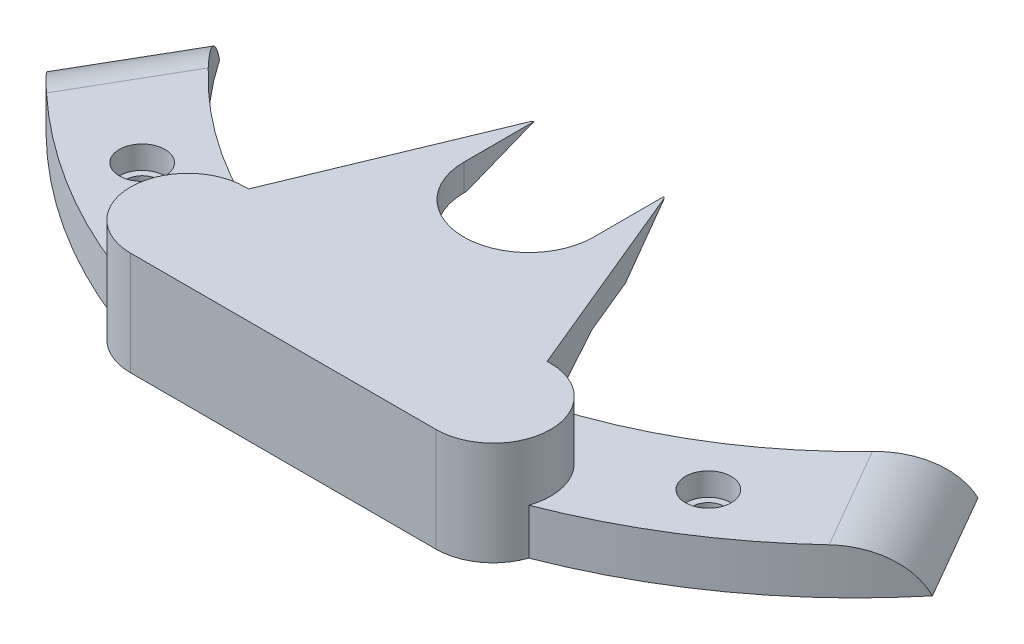
ISO-10303-21;
HEADER;
FILE_DESCRIPTION(('STEP AP214'),'2;1');
FILE_NAME('part.step','',(''),(''),'','','');
FILE_SCHEMA(('AUTOMOTIVE_DESIGN { 1 0 10303 214 1 1 1 1 }'));
ENDSEC;
DATA;
#1=APPLICATION_CONTEXT('core data for automotive mechanical design processes');
#2=APPLICATION_PROTOCOL_DEFINITION('international standard','automotive_design',2000,#1);
#3=PRODUCT_CONTEXT('',#1,'mechanical');
#4=PRODUCT('Part','Part','',(#3));
#5=PRODUCT_RELATED_PRODUCT_CATEGORY('part','',(#4));
#6=PRODUCT_DEFINITION_FORMATION('','',#4);
#7=PRODUCT_DEFINITION_CONTEXT('part definition',#1,'design');
#8=PRODUCT_DEFINITION('design','',#6,#7);
#9=PRODUCT_DEFINITION_SHAPE('','',#8);
#10=(LENGTH_UNIT() NAMED_UNIT(*) SI_UNIT(.MILLI.,.METRE.));
#11=(NAMED_UNIT(*) PLANE_ANGLE_UNIT() SI_UNIT($,.RADIAN.));
#12=(NAMED_UNIT(*) SI_UNIT($,.STERADIAN.) SOLID_ANGLE_UNIT());
#13=UNCERTAINTY_MEASURE_WITH_UNIT(LENGTH_MEASURE(1.E-05),#10,'distance_accuracy_value','');
#14=(GEOMETRIC_REPRESENTATION_CONTEXT(3) GLOBAL_UNCERTAINTY_ASSIGNED_CONTEXT((#13)) GLOBAL_UNIT_ASSIGNED_CONTEXT((#10,
#11,#12)) REPRESENTATION_CONTEXT('',''));
#15=CARTESIAN_POINT('',(0.,0.,0.));
#16=DIRECTION('',(0.,0.,1.));
#17=DIRECTION('',(1.,0.,0.));
#18=AXIS2_PLACEMENT_3D('',#15,#16,#17);
#19=CARTESIAN_POINT('',(37.0643969767601,-0.678255730241038,-11.0875109818614));
#20=DIRECTION('',(0.,1.,0.));
#21=DIRECTION('',(0.,0.,1.));
#22=AXIS2_PLACEMENT_3D('',#19,#20,#21);
#23=CYLINDRICAL_SURFACE('',#22,2.15);
#24=CARTESIAN_POINT('',(37.0643969767601,0.,-11.0875109818614));
#25=DIRECTION('',(0.,1.,0.));
#26=DIRECTION('',(0.,0.,1.));
#27=AXIS2_PLACEMENT_3D('',#24,#25,#26);
#28=CIRCLE('',#27,2.15);
#29=CARTESIAN_POINT('',(37.0643969767601,0.,-8.93751098186139));
#30=VERTEX_POINT('',#29);
#31=EDGE_CURVE('E203',#30,#30,#28,.T.);
#32=ORIENTED_EDGE('',*,*,#31,.F.);
#33=EDGE_LOOP('',(#32));
#34=FACE_BOUND('',#33,.T.);
#35=CARTESIAN_POINT('',(37.0643969767601,3.,-11.0875109818614));
#36=DIRECTION('',(0.,1.,0.));
#37=DIRECTION('',(0.,0.,1.));
#38=AXIS2_PLACEMENT_3D('',#35,#36,#37);
#39=CIRCLE('',#38,2.15);
#40=CARTESIAN_POINT('',(37.0643969767601,3.,-8.93751098186139));
#41=VERTEX_POINT('',#40);
#42=EDGE_CURVE('E293',#41,#41,#39,.T.);
#43=ORIENTED_EDGE('',*,*,#42,.T.);
#44=EDGE_LOOP('',(#43));
#45=FACE_BOUND('',#44,.T.);
#46=ADVANCED_FACE('F44',(#34,#45),#23,.F.);
#47=CARTESIAN_POINT('',(0.,0.,0.));
#48=DIRECTION('',(0.,1.,0.));
#49=DIRECTION('',(0.,0.,1.));
#50=AXIS2_PLACEMENT_3D('',#47,#48,#49);
#51=PLANE('',#50);
#52=DIRECTION('',(-0.500000000000002,0.,0.866025403784438));
#53=VECTOR('',#52,1.);
#54=CARTESIAN_POINT('',(-51.876435834862,0.,-29.9508741938561));
#55=LINE('',#54,#53);
#56=CARTESIAN_POINT('',(-49.6484768628359,0.,-33.8098123305843));
#57=VERTEX_POINT('',#56);
#58=CARTESIAN_POINT('',(-57.7945080633783,0.,-19.7004724112036));
#59=VERTEX_POINT('',#58);
#60=EDGE_CURVE('E202',#57,#59,#55,.T.);
#61=ORIENTED_EDGE('',*,*,#60,.F.);
#62=CARTESIAN_POINT('',(0.,0.,-67.5));
#63=DIRECTION('',(0.,1.,0.));
#64=DIRECTION('',(0.,0.,1.));
#65=AXIS2_PLACEMENT_3D('',#62,#63,#64);
#66=CIRCLE('',#65,60.);
#67=CARTESIAN_POINT('',(49.6484768628359,0.,-33.8098123305843));
#68=VERTEX_POINT('',#67);
#69=EDGE_CURVE('E190',#57,#68,#66,.T.);
#70=ORIENTED_EDGE('',*,*,#69,.T.);
#71=DIRECTION('',(0.500000000000002,0.,0.866025403784438));
#72=VECTOR('',#71,1.);
#73=CARTESIAN_POINT('',(51.8764358348621,0.,-29.9508741938561));
#74=LINE('',#73,#72);
#75=CARTESIAN_POINT('',(57.7945080633783,0.,-19.7004724112036));
#76=VERTEX_POINT('',#75);
#77=EDGE_CURVE('E335',#68,#76,#74,.T.);
#78=ORIENTED_EDGE('',*,*,#77,.T.);
#79=CARTESIAN_POINT('',(0.,0.,-67.5));
#80=DIRECTION('',(0.,1.,0.));
#81=DIRECTION('',(0.,0.,1.));
#82=AXIS2_PLACEMENT_3D('',#79,#80,#81);
#83=CIRCLE('',#82,75.);
#84=CARTESIAN_POINT('',(27.0936388955902,0.,2.43521810501034));
#85=VERTEX_POINT('',#84);
#86=EDGE_CURVE('E213',#85,#76,#83,.T.);
#87=ORIENTED_EDGE('',*,*,#86,.F.);
#88=CARTESIAN_POINT('',(20.,0.,0.));
#89=DIRECTION('',(0.,1.,0.));
#90=DIRECTION('',(0.,0.,1.));
#91=AXIS2_PLACEMENT_3D('',#88,#89,#90);
#92=CIRCLE('',#91,7.5);
#93=CARTESIAN_POINT('',(20.,0.,7.5));
#94=VERTEX_POINT('',#93);
#95=EDGE_CURVE('E449',#94,#85,#92,.T.);
#96=ORIENTED_EDGE('',*,*,#95,.F.);
#97=DIRECTION('',(-1.,0.,0.));
#98=VECTOR('',#97,1.);
#99=CARTESIAN_POINT('',(0.,0.,7.50000000000001));
#100=LINE('',#99,#98);
#101=CARTESIAN_POINT('',(-20.,0.,7.5));
#102=VERTEX_POINT('',#101);
#103=EDGE_CURVE('E455',#94,#102,#100,.T.);
#104=ORIENTED_EDGE('',*,*,#103,.T.);
#105=CARTESIAN_POINT('',(-20.,0.,0.));
#106=DIRECTION('',(0.,1.,0.));
#107=DIRECTION('',(0.,0.,1.));
#108=AXIS2_PLACEMENT_3D('',#105,#106,#107);
#109=CIRCLE('',#108,7.5);
#110=CARTESIAN_POINT('',(-27.0936388955902,0.,2.43521810501034));
#111=VERTEX_POINT('',#110);
#112=EDGE_CURVE('E469',#111,#102,#109,.T.);
#113=ORIENTED_EDGE('',*,*,#112,.F.);
#114=EDGE_CURVE('E210',#59,#111,#83,.T.);
#115=ORIENTED_EDGE('',*,*,#114,.F.);
#116=EDGE_LOOP('',(#61,#70,#78,#87,#96,#104,#113,#115));
#117=FACE_BOUND('',#116,.T.);
#118=CARTESIAN_POINT('',(-37.0643969767601,0.,-11.0875109818614));
#119=DIRECTION('',(0.,1.,0.));
#120=DIRECTION('',(0.,0.,1.));
#121=AXIS2_PLACEMENT_3D('',#118,#119,#120);
#122=CIRCLE('',#121,2.15);
#123=CARTESIAN_POINT('',(-37.0643969767601,0.,-8.93751098186139));
#124=VERTEX_POINT('',#123);
#125=EDGE_CURVE('E298',#124,#124,#122,.F.);
#126=ORIENTED_EDGE('',*,*,#125,.F.);
#127=EDGE_LOOP('',(#126));
#128=FACE_BOUND('',#127,.T.);
#129=ORIENTED_EDGE('',*,*,#31,.T.);
#130=EDGE_LOOP('',(#129));
#131=FACE_BOUND('',#130,.T.);
#132=ADVANCED_FACE('F207',(#117,#128,#131),#51,.F.);
#133=CARTESIAN_POINT('',(20.,13.57,0.));
#134=DIRECTION('',(0.,-1.,0.));
#135=DIRECTION('',(0.,0.,-1.));
#136=AXIS2_PLACEMENT_3D('',#133,#134,#135);
#137=CYLINDRICAL_SURFACE('',#136,7.5);
#138=DIRECTION('',(0.,-1.,0.));
#139=VECTOR('',#138,1.);
#140=CARTESIAN_POINT('',(27.0936388955902,3.,2.43521810501034));
#141=LINE('',#140,#139);
#142=CARTESIAN_POINT('',(27.0936388955902,6.,2.43521810501034));
#143=VERTEX_POINT('',#142);
#144=EDGE_CURVE('E341',#143,#85,#141,.T.);
#145=ORIENTED_EDGE('',*,*,#144,.F.);
#146=CARTESIAN_POINT('',(20.,6.,0.));
#147=DIRECTION('',(0.,1.,0.));
#148=DIRECTION('',(0.,0.,1.));
#149=AXIS2_PLACEMENT_3D('',#146,#147,#148);
#150=CIRCLE('',#149,7.5);
#151=CARTESIAN_POINT('',(20.,6.,-7.50000000000001));
#152=VERTEX_POINT('',#151);
#153=EDGE_CURVE('E354',#143,#152,#150,.T.);
#154=ORIENTED_EDGE('',*,*,#153,.T.);
#155=DIRECTION('',(0.,-1.,0.));
#156=VECTOR('',#155,1.);
#157=CARTESIAN_POINT('',(20.,13.57,-7.50000000000001));
#158=LINE('',#157,#156);
#159=CARTESIAN_POINT('',(20.,13.57,-7.50000000000001));
#160=VERTEX_POINT('',#159);
#161=EDGE_CURVE('E485',#160,#152,#158,.T.);
#162=ORIENTED_EDGE('',*,*,#161,.F.);
#163=CARTESIAN_POINT('',(20.,13.57,0.));
#164=DIRECTION('',(0.,1.,0.));
#165=DIRECTION('',(0.,0.,1.));
#166=AXIS2_PLACEMENT_3D('',#163,#164,#165);
#167=CIRCLE('',#166,7.5);
#168=CARTESIAN_POINT('',(20.,13.57,7.5));
#169=VERTEX_POINT('',#168);
#170=EDGE_CURVE('E450',#169,#160,#167,.T.);
#171=ORIENTED_EDGE('',*,*,#170,.F.);
#172=DIRECTION('',(0.,-1.,0.));
#173=VECTOR('',#172,1.);
#174=CARTESIAN_POINT('',(20.,13.57,7.5));
#175=LINE('',#174,#173);
#176=EDGE_CURVE('E466',#169,#94,#175,.T.);
#177=ORIENTED_EDGE('',*,*,#176,.T.);
#178=ORIENTED_EDGE('',*,*,#95,.T.);
#179=EDGE_LOOP('',(#145,#154,#162,#171,#177,#178));
#180=FACE_BOUND('',#179,.T.);
#181=ADVANCED_FACE('F246',(#180),#137,.T.);
#182=CARTESIAN_POINT('',(-20.,13.57,0.));
#183=DIRECTION('',(0.,-1.,0.));
#184=DIRECTION('',(0.,0.,-1.));
#185=AXIS2_PLACEMENT_3D('',#182,#183,#184);
#186=CYLINDRICAL_SURFACE('',#185,7.5);
#187=DIRECTION('',(0.,-1.,0.));
#188=VECTOR('',#187,1.);
#189=CARTESIAN_POINT('',(-27.0936388955902,3.,2.43521810501034));
#190=LINE('',#189,#188);
#191=CARTESIAN_POINT('',(-27.0936388955902,6.,2.43521810501034));
#192=VERTEX_POINT('',#191);
#193=EDGE_CURVE('E331',#111,#192,#190,.F.);
#194=ORIENTED_EDGE('',*,*,#193,.F.);
#195=ORIENTED_EDGE('',*,*,#112,.T.);
#196=DIRECTION('',(0.,-1.,0.));
#197=VECTOR('',#196,1.);
#198=CARTESIAN_POINT('',(-20.,13.57,7.5));
#199=LINE('',#198,#197);
#200=CARTESIAN_POINT('',(-20.,13.57,7.5));
#201=VERTEX_POINT('',#200);
#202=EDGE_CURVE('E477',#201,#102,#199,.T.);
#203=ORIENTED_EDGE('',*,*,#202,.F.);
#204=CARTESIAN_POINT('',(-20.,13.57,0.));
#205=DIRECTION('',(0.,1.,0.));
#206=DIRECTION('',(0.,0.,1.));
#207=AXIS2_PLACEMENT_3D('',#204,#205,#206);
#208=CIRCLE('',#207,7.5);
#209=CARTESIAN_POINT('',(-20.,13.57,-7.50000000000001));
#210=VERTEX_POINT('',#209);
#211=EDGE_CURVE('E459',#210,#201,#208,.T.);
#212=ORIENTED_EDGE('',*,*,#211,.F.);
#213=DIRECTION('',(0.,-1.,0.));
#214=VECTOR('',#213,1.);
#215=CARTESIAN_POINT('',(-20.,13.57,-7.50000000000001));
#216=LINE('',#215,#214);
#217=CARTESIAN_POINT('',(-20.,6.,-7.50000000000001));
#218=VERTEX_POINT('',#217);
#219=EDGE_CURVE('E481',#210,#218,#216,.T.);
#220=ORIENTED_EDGE('',*,*,#219,.T.);
#221=CARTESIAN_POINT('',(-20.,6.,0.));
#222=DIRECTION('',(0.,1.,0.));
#223=DIRECTION('',(0.,0.,1.));
#224=AXIS2_PLACEMENT_3D('',#221,#222,#223);
#225=CIRCLE('',#224,7.5);
#226=EDGE_CURVE('E345',#218,#192,#225,.T.);
#227=ORIENTED_EDGE('',*,*,#226,.T.);
#228=EDGE_LOOP('',(#194,#195,#203,#212,#220,#227));
#229=FACE_BOUND('',#228,.T.);
#230=ADVANCED_FACE('F516',(#229),#186,.T.);
#231=CARTESIAN_POINT('',(0.,10.07,0.));
#232=DIRECTION('',(0.,-1.,0.));
#233=DIRECTION('',(0.,0.,-1.));
#234=AXIS2_PLACEMENT_3D('',#231,#232,#233);
#235=PLANE('',#234);
#236=DIRECTION('',(0.382683432365088,0.,-0.923879532511288));
#237=VECTOR('',#236,1.);
#238=CARTESIAN_POINT('',(-19.3378180594762,10.07,-8.00998650693836));
#239=LINE('',#238,#237);
#240=CARTESIAN_POINT('',(-15.4069257635464,10.07,-17.5));
#241=VERTEX_POINT('',#240);
#242=CARTESIAN_POINT('',(-12.3003240457482,10.07,-25.));
#243=VERTEX_POINT('',#242);
#244=EDGE_CURVE('E385',#241,#243,#239,.T.);
#245=ORIENTED_EDGE('',*,*,#244,.T.);
#246=DIRECTION('',(1.,0.,0.));
#247=VECTOR('',#246,1.);
#248=CARTESIAN_POINT('',(-27.5,10.07,-25.));
#249=LINE('',#248,#247);
#250=CARTESIAN_POINT('',(-8.5,10.07,-25.));
#251=VERTEX_POINT('',#250);
#252=EDGE_CURVE('E357',#243,#251,#249,.T.);
#253=ORIENTED_EDGE('',*,*,#252,.T.);
#254=DIRECTION('',(0.,0.,-1.));
#255=VECTOR('',#254,1.);
#256=CARTESIAN_POINT('',(-8.5,10.07,0.));
#257=LINE('',#256,#255);
#258=CARTESIAN_POINT('',(-8.5,10.07,-24.6446609406726));
#259=VERTEX_POINT('',#258);
#260=EDGE_CURVE('E389',#259,#251,#257,.T.);
#261=ORIENTED_EDGE('',*,*,#260,.F.);
#262=CARTESIAN_POINT('',(0.,10.07,-24.6446609406726));
#263=DIRECTION('',(0.,-1.,0.));
#264=DIRECTION('',(0.,0.,-1.));
#265=AXIS2_PLACEMENT_3D('',#262,#263,#264);
#266=CIRCLE('',#265,8.5);
#267=CARTESIAN_POINT('',(-4.60476058474564,10.07,-17.5));
#268=VERTEX_POINT('',#267);
#269=EDGE_CURVE('E394',#268,#259,#266,.T.);
#270=ORIENTED_EDGE('',*,*,#269,.F.);
#271=DIRECTION('',(1.,0.,0.));
#272=VECTOR('',#271,1.);
#273=CARTESIAN_POINT('',(0.,10.07,-17.5));
#274=LINE('',#273,#272);
#275=EDGE_CURVE('E493',#241,#268,#274,.T.);
#276=ORIENTED_EDGE('',*,*,#275,.F.);
#277=EDGE_LOOP('',(#245,#253,#261,#270,#276));
#278=FACE_BOUND('',#277,.T.);
#279=ADVANCED_FACE('F656',(#278),#235,.T.);
#280=CARTESIAN_POINT('',(-19.3378180594762,10.07,-8.00998650693836));
#281=DIRECTION('',(0.923879532511288,0.,0.382683432365088));
#282=DIRECTION('',(0.382683432365088,0.,-0.923879532511288));
#283=AXIS2_PLACEMENT_3D('',#280,#281,#282);
#284=PLANE('',#283);
#285=DIRECTION('',(0.359248714802625,0.344565900440048,-0.867303119541606));
#286=VECTOR('',#285,1.);
#287=CARTESIAN_POINT('',(-18.5022869397374,4.1215168433178,-10.0271370679966));
#288=LINE('',#287,#286);
#289=CARTESIAN_POINT('',(-8.74985633925714,13.4753569347981,-33.5715872897785));
#290=VERTEX_POINT('',#289);
#291=EDGE_CURVE('E377',#243,#290,#288,.T.);
#292=ORIENTED_EDGE('',*,*,#291,.F.);
#293=ORIENTED_EDGE('',*,*,#244,.F.);
#294=DIRECTION('',(-0.369646040225898,-0.258797300241354,0.892404483590877));
#295=VECTOR('',#294,1.);
#296=CARTESIAN_POINT('',(-20.567144190783,6.45721789956574,-5.04213068815773));
#297=LINE('',#296,#295);
#298=CARTESIAN_POINT('',(-19.5490613872773,7.17,-7.50000000000001));
#299=VERTEX_POINT('',#298);
#300=EDGE_CURVE('E501',#241,#299,#297,.T.);
#301=ORIENTED_EDGE('',*,*,#300,.T.);
#302=DIRECTION('',(0.,1.,0.));
#303=VECTOR('',#302,1.);
#304=CARTESIAN_POINT('',(-19.5490613872773,10.07,-7.5));
#305=LINE('',#304,#303);
#306=CARTESIAN_POINT('',(-19.5490613872773,13.57,-7.50000000000001));
#307=VERTEX_POINT('',#306);
#308=EDGE_CURVE('E406',#299,#307,#305,.T.);
#309=ORIENTED_EDGE('',*,*,#308,.T.);
#310=DIRECTION('',(0.382683432365088,0.,-0.923879532511288));
#311=VECTOR('',#310,1.);
#312=CARTESIAN_POINT('',(-19.3378180594762,13.57,-8.00998650693836));
#313=LINE('',#312,#311);
#314=CARTESIAN_POINT('',(-8.74985633925714,13.57,-33.5715872897785));
#315=VERTEX_POINT('',#314);
#316=EDGE_CURVE('E384',#307,#315,#313,.T.);
#317=ORIENTED_EDGE('',*,*,#316,.T.);
#318=DIRECTION('',(0.,1.,0.));
#319=VECTOR('',#318,1.);
#320=CARTESIAN_POINT('',(-8.74985633925714,10.07,-33.5715872897785));
#321=LINE('',#320,#319);
#322=EDGE_CURVE('E446',#290,#315,#321,.T.);
#323=ORIENTED_EDGE('',*,*,#322,.F.);
#324=EDGE_LOOP('',(#292,#293,#301,#309,#317,#323));
#325=FACE_BOUND('',#324,.T.);
#326=ADVANCED_FACE('F685',(#325),#284,.F.);
#327=CARTESIAN_POINT('',(0.,10.07,-24.6446609406726));
#328=DIRECTION('',(0.,1.,0.));
#329=DIRECTION('',(0.,0.,1.));
#330=AXIS2_PLACEMENT_3D('',#327,#328,#329);
#331=CYLINDRICAL_SURFACE('',#330,12.5);
#332=CARTESIAN_POINT('',(0.,9.92882937558974,-24.6446609406726));
#333=DIRECTION('',(0.,-0.929344429209361,-0.36921393784299));
#334=DIRECTION('',(0.,0.36921393784299,-0.929344429209361));
#335=AXIS2_PLACEMENT_3D('',#332,#333,#334);
#336=ELLIPSE('',#335,13.4503415602699,12.5);
#337=CARTESIAN_POINT('',(-8.5,13.57,-33.8098123305843));
#338=VERTEX_POINT('',#337);
#339=EDGE_CURVE('E374',#290,#338,#336,.T.);
#340=ORIENTED_EDGE('',*,*,#339,.F.);
#341=ORIENTED_EDGE('',*,*,#322,.T.);
#342=CARTESIAN_POINT('',(0.,13.57,-24.6446609406726));
#343=DIRECTION('',(0.,-1.,0.));
#344=DIRECTION('',(0.,0.,-1.));
#345=AXIS2_PLACEMENT_3D('',#342,#343,#344);
#346=CIRCLE('',#345,12.5);
#347=EDGE_CURVE('E410',#315,#338,#346,.T.);
#348=ORIENTED_EDGE('',*,*,#347,.T.);
#349=EDGE_LOOP('',(#340,#341,#348));
#350=FACE_BOUND('',#349,.T.);
#351=ADVANCED_FACE('F695',(#350),#331,.T.);
#352=CARTESIAN_POINT('',(-8.5,10.07,0.));
#353=DIRECTION('',(1.,0.,0.));
#354=DIRECTION('',(0.,0.,-1.));
#355=AXIS2_PLACEMENT_3D('',#352,#353,#354);
#356=PLANE('',#355);
#357=ORIENTED_EDGE('',*,*,#260,.T.);
#358=DIRECTION('',(0.,0.36921393784299,-0.929344429209361));
#359=VECTOR('',#358,1.);
#360=CARTESIAN_POINT('',(-8.5,1.49182709197915,-3.40797329743819));
#361=LINE('',#360,#359);
#362=EDGE_CURVE('E370',#251,#338,#361,.T.);
#363=ORIENTED_EDGE('',*,*,#362,.T.);
#364=DIRECTION('',(0.,0.,-1.));
#365=VECTOR('',#364,1.);
#366=CARTESIAN_POINT('',(-8.5,13.57,0.));
#367=LINE('',#366,#365);
#368=CARTESIAN_POINT('',(-8.5,13.57,-24.6446609406726));
#369=VERTEX_POINT('',#368);
#370=EDGE_CURVE('E414',#369,#338,#367,.T.);
#371=ORIENTED_EDGE('',*,*,#370,.F.);
#372=DIRECTION('',(0.,1.,0.));
#373=VECTOR('',#372,1.);
#374=CARTESIAN_POINT('',(-8.5,10.07,-24.6446609406726));
#375=LINE('',#374,#373);
#376=EDGE_CURVE('E443',#259,#369,#375,.T.);
#377=ORIENTED_EDGE('',*,*,#376,.F.);
#378=EDGE_LOOP('',(#357,#363,#371,#377));
#379=FACE_BOUND('',#378,.T.);
#380=ADVANCED_FACE('F706',(#379),#356,.T.);
#381=CARTESIAN_POINT('',(8.5,10.07,0.));
#382=DIRECTION('',(1.,0.,0.));
#383=DIRECTION('',(0.,0.,-1.));
#384=AXIS2_PLACEMENT_3D('',#381,#382,#383);
#385=PLANE('',#384);
#386=DIRECTION('',(0.,0.36921393784299,-0.929344429209361));
#387=VECTOR('',#386,1.);
#388=CARTESIAN_POINT('',(8.5,1.49182709197915,-3.40797329743819));
#389=LINE('',#388,#387);
#390=CARTESIAN_POINT('',(8.5,10.07,-25.));
#391=VERTEX_POINT('',#390);
#392=CARTESIAN_POINT('',(8.5,13.57,-33.8098123305843));
#393=VERTEX_POINT('',#392);
#394=EDGE_CURVE('E367',#391,#393,#389,.T.);
#395=ORIENTED_EDGE('',*,*,#394,.F.);
#396=DIRECTION('',(0.,0.,-1.));
#397=VECTOR('',#396,1.);
#398=CARTESIAN_POINT('',(8.5,10.07,0.));
#399=LINE('',#398,#397);
#400=CARTESIAN_POINT('',(8.5,10.07,-24.6446609406726));
#401=VERTEX_POINT('',#400);
#402=EDGE_CURVE('E399',#401,#391,#399,.T.);
#403=ORIENTED_EDGE('',*,*,#402,.F.);
#404=DIRECTION('',(0.,1.,0.));
#405=VECTOR('',#404,1.);
#406=CARTESIAN_POINT('',(8.5,10.07,-24.6446609406726));
#407=LINE('',#406,#405);
#408=CARTESIAN_POINT('',(8.5,13.57,-24.6446609406726));
#409=VERTEX_POINT('',#408);
#410=EDGE_CURVE('E440',#401,#409,#407,.T.);
#411=ORIENTED_EDGE('',*,*,#410,.T.);
#412=DIRECTION('',(0.,0.,-1.));
#413=VECTOR('',#412,1.);
#414=CARTESIAN_POINT('',(8.5,13.57,0.));
#415=LINE('',#414,#413);
#416=EDGE_CURVE('E423',#409,#393,#415,.T.);
#417=ORIENTED_EDGE('',*,*,#416,.T.);
#418=EDGE_LOOP('',(#395,#403,#411,#417));
#419=FACE_BOUND('',#418,.T.);
#420=ADVANCED_FACE('F718',(#419),#385,.F.);
#421=CARTESIAN_POINT('',(0.,9.92882937558974,-24.6446609406726));
#422=DIRECTION('',(0.,-0.929344429209361,-0.36921393784299));
#423=DIRECTION('',(0.,0.36921393784299,-0.929344429209361));
#424=AXIS2_PLACEMENT_3D('',#421,#422,#423);
#425=ELLIPSE('',#424,13.4503415602699,12.5);
#426=CARTESIAN_POINT('',(8.74985633925712,13.4753569347981,-33.5715872897786));
#427=VERTEX_POINT('',#426);
#428=EDGE_CURVE('E364',#393,#427,#425,.T.);
#429=ORIENTED_EDGE('',*,*,#428,.F.);
#430=CARTESIAN_POINT('',(8.74985633925712,13.57,-33.5715872897786));
#431=VERTEX_POINT('',#430);
#432=EDGE_CURVE('E415',#393,#431,#346,.T.);
#433=ORIENTED_EDGE('',*,*,#432,.T.);
#434=DIRECTION('',(0.,1.,0.));
#435=VECTOR('',#434,1.);
#436=CARTESIAN_POINT('',(8.74985633925712,10.07,-33.5715872897786));
#437=LINE('',#436,#435);
#438=EDGE_CURVE('E437',#427,#431,#437,.T.);
#439=ORIENTED_EDGE('',*,*,#438,.F.);
#440=EDGE_LOOP('',(#429,#433,#439));
#441=FACE_BOUND('',#440,.T.);
#442=ADVANCED_FACE('F709',(#441),#331,.T.);
#443=CARTESIAN_POINT('',(19.3378180594762,10.07,-8.00998650693833));
#444=DIRECTION('',(-0.923879532511288,0.,0.382683432365087));
#445=DIRECTION('',(0.382683432365087,0.,0.923879532511288));
#446=AXIS2_PLACEMENT_3D('',#443,#444,#445);
#447=PLANE('',#446);
#448=DIRECTION('',(0.359248714802624,-0.344565900440048,0.867303119541606));
#449=VECTOR('',#448,1.);
#450=CARTESIAN_POINT('',(18.5022869397374,4.12151684331779,-10.0271370679966));
#451=LINE('',#450,#449);
#452=CARTESIAN_POINT('',(12.3003240457482,10.07,-25.));
#453=VERTEX_POINT('',#452);
#454=EDGE_CURVE('E361',#427,#453,#451,.T.);
#455=ORIENTED_EDGE('',*,*,#454,.F.);
#456=ORIENTED_EDGE('',*,*,#438,.T.);
#457=DIRECTION('',(0.382683432365087,0.,0.923879532511288));
#458=VECTOR('',#457,1.);
#459=CARTESIAN_POINT('',(19.3378180594762,13.57,-8.00998650693833));
#460=LINE('',#459,#458);
#461=CARTESIAN_POINT('',(19.5490613872773,13.57,-7.5));
#462=VERTEX_POINT('',#461);
#463=EDGE_CURVE('E390',#431,#462,#460,.T.);
#464=ORIENTED_EDGE('',*,*,#463,.T.);
#465=DIRECTION('',(0.,1.,0.));
#466=VECTOR('',#465,1.);
#467=CARTESIAN_POINT('',(19.5490613872773,10.07,-7.5));
#468=LINE('',#467,#466);
#469=CARTESIAN_POINT('',(19.5490613872773,7.17,-7.50000000000001));
#470=VERTEX_POINT('',#469);
#471=EDGE_CURVE('E433',#470,#462,#468,.T.);
#472=ORIENTED_EDGE('',*,*,#471,.F.);
#473=DIRECTION('',(-0.369646040225896,0.258797300241355,-0.892404483590878));
#474=VECTOR('',#473,1.);
#475=CARTESIAN_POINT('',(13.18868165783,11.6230413513557,-22.8553150046747));
#476=LINE('',#475,#474);
#477=CARTESIAN_POINT('',(15.4069257635464,10.07,-17.5));
#478=VERTEX_POINT('',#477);
#479=EDGE_CURVE('E494',#470,#478,#476,.T.);
#480=ORIENTED_EDGE('',*,*,#479,.T.);
#481=DIRECTION('',(0.382683432365087,0.,0.923879532511288));
#482=VECTOR('',#481,1.);
#483=CARTESIAN_POINT('',(19.3378180594762,10.07,-8.00998650693833));
#484=LINE('',#483,#482);
#485=EDGE_CURVE('E403',#453,#478,#484,.T.);
#486=ORIENTED_EDGE('',*,*,#485,.F.);
#487=EDGE_LOOP('',(#455,#456,#464,#472,#480,#486));
#488=FACE_BOUND('',#487,.T.);
#489=ADVANCED_FACE('F739',(#488),#447,.F.);
#490=ORIENTED_EDGE('',*,*,#402,.T.);
#491=DIRECTION('',(1.,0.,0.));
#492=VECTOR('',#491,1.);
#493=CARTESIAN_POINT('',(0.,10.07,-25.));
#494=LINE('',#493,#492);
#495=EDGE_CURVE('E504',#391,#453,#494,.T.);
#496=ORIENTED_EDGE('',*,*,#495,.T.);
#497=ORIENTED_EDGE('',*,*,#485,.T.);
#498=CARTESIAN_POINT('',(4.60476058474564,10.07,-17.5));
#499=VERTEX_POINT('',#498);
#500=EDGE_CURVE('E489',#499,#478,#274,.T.);
#501=ORIENTED_EDGE('',*,*,#500,.F.);
#502=EDGE_CURVE('E395',#401,#499,#266,.T.);
#503=ORIENTED_EDGE('',*,*,#502,.F.);
#504=EDGE_LOOP('',(#490,#496,#497,#501,#503));
#505=FACE_BOUND('',#504,.T.);
#506=ADVANCED_FACE('F688',(#505),#235,.T.);
#507=CARTESIAN_POINT('',(0.,13.57,-7.50000000000001));
#508=DIRECTION('',(0.,0.,-1.));
#509=DIRECTION('',(-1.,0.,0.));
#510=AXIS2_PLACEMENT_3D('',#507,#508,#509);
#511=PLANE('',#510);
#512=DIRECTION('',(1.,0.,0.));
#513=VECTOR('',#512,1.);
#514=CARTESIAN_POINT('',(0.,6.,-7.50000000000001));
#515=LINE('',#514,#513);
#516=CARTESIAN_POINT('',(0.,6.,-7.50000000000001));
#517=VERTEX_POINT('',#516);
#518=EDGE_CURVE('E349',#218,#517,#515,.T.);
#519=ORIENTED_EDGE('',*,*,#518,.F.);
#520=ORIENTED_EDGE('',*,*,#219,.F.);
#521=DIRECTION('',(1.,0.,0.));
#522=VECTOR('',#521,1.);
#523=CARTESIAN_POINT('',(0.,13.57,-7.50000000000001));
#524=LINE('',#523,#522);
#525=EDGE_CURVE('E456',#210,#307,#524,.T.);
#526=ORIENTED_EDGE('',*,*,#525,.T.);
#527=ORIENTED_EDGE('',*,*,#308,.F.);
#528=DIRECTION('',(1.,0.,0.));
#529=VECTOR('',#528,1.);
#530=CARTESIAN_POINT('',(-27.,7.17,-7.50000000000001));
#531=LINE('',#530,#529);
#532=EDGE_CURVE('E380',#299,#470,#531,.T.);
#533=ORIENTED_EDGE('',*,*,#532,.T.);
#534=ORIENTED_EDGE('',*,*,#471,.T.);
#535=EDGE_CURVE('E454',#462,#160,#524,.T.);
#536=ORIENTED_EDGE('',*,*,#535,.T.);
#537=ORIENTED_EDGE('',*,*,#161,.T.);
#538=EDGE_CURVE('E353',#517,#152,#515,.T.);
#539=ORIENTED_EDGE('',*,*,#538,.F.);
#540=EDGE_LOOP('',(#519,#520,#526,#527,#533,#534,#536,#537,#539));
#541=FACE_BOUND('',#540,.T.);
#542=ADVANCED_FACE('F759',(#541),#511,.T.);
#543=CARTESIAN_POINT('',(0.,13.57,7.50000000000001));
#544=DIRECTION('',(0.,0.,1.));
#545=DIRECTION('',(1.,0.,0.));
#546=AXIS2_PLACEMENT_3D('',#543,#544,#545);
#547=PLANE('',#546);
#548=ORIENTED_EDGE('',*,*,#103,.F.);
#549=ORIENTED_EDGE('',*,*,#176,.F.);
#550=DIRECTION('',(-1.,0.,0.));
#551=VECTOR('',#550,1.);
#552=CARTESIAN_POINT('',(0.,13.57,7.50000000000001));
#553=LINE('',#552,#551);
#554=EDGE_CURVE('E462',#169,#201,#553,.T.);
#555=ORIENTED_EDGE('',*,*,#554,.T.);
#556=ORIENTED_EDGE('',*,*,#202,.T.);
#557=EDGE_LOOP('',(#548,#549,#555,#556));
#558=FACE_BOUND('',#557,.T.);
#559=ADVANCED_FACE('F790',(#558),#547,.T.);
#560=CARTESIAN_POINT('',(0.,13.57,0.));
#561=DIRECTION('',(0.,1.,0.));
#562=DIRECTION('',(0.,0.,1.));
#563=AXIS2_PLACEMENT_3D('',#560,#561,#562);
#564=PLANE('',#563);
#565=ORIENTED_EDGE('',*,*,#170,.T.);
#566=ORIENTED_EDGE('',*,*,#535,.F.);
#567=ORIENTED_EDGE('',*,*,#463,.F.);
#568=ORIENTED_EDGE('',*,*,#432,.F.);
#569=ORIENTED_EDGE('',*,*,#416,.F.);
#570=CARTESIAN_POINT('',(0.,13.57,-24.6446609406726));
#571=DIRECTION('',(0.,-1.,0.));
#572=DIRECTION('',(0.,0.,-1.));
#573=AXIS2_PLACEMENT_3D('',#570,#571,#572);
#574=CIRCLE('',#573,8.5);
#575=EDGE_CURVE('E419',#409,#369,#574,.T.);
#576=ORIENTED_EDGE('',*,*,#575,.T.);
#577=ORIENTED_EDGE('',*,*,#370,.T.);
#578=ORIENTED_EDGE('',*,*,#347,.F.);
#579=ORIENTED_EDGE('',*,*,#316,.F.);
#580=ORIENTED_EDGE('',*,*,#525,.F.);
#581=ORIENTED_EDGE('',*,*,#211,.T.);
#582=ORIENTED_EDGE('',*,*,#554,.F.);
#583=EDGE_LOOP('',(#565,#566,#567,#568,#569,#576,#577,#578,#579,#580,#581,#582));
#584=FACE_BOUND('',#583,.T.);
#585=ADVANCED_FACE('F780',(#584),#564,.T.);
#586=CARTESIAN_POINT('',(0.,10.07,-24.6446609406726));
#587=DIRECTION('',(0.,1.,0.));
#588=DIRECTION('',(0.,0.,1.));
#589=AXIS2_PLACEMENT_3D('',#586,#587,#588);
#590=CYLINDRICAL_SURFACE('',#589,8.5);
#591=ORIENTED_EDGE('',*,*,#575,.F.);
#592=ORIENTED_EDGE('',*,*,#410,.F.);
#593=ORIENTED_EDGE('',*,*,#502,.T.);
#594=CARTESIAN_POINT('',(0.,12.1419516727951,-24.6446609406726));
#595=DIRECTION('',(0.,-0.960429138778732,-0.278524450245832));
#596=DIRECTION('',(0.,0.278524450245832,-0.960429138778732));
#597=AXIS2_PLACEMENT_3D('',#594,#595,#596);
#598=ELLIPSE('',#597,8.8502104494752,8.5);
#599=EDGE_CURVE('E498',#499,#268,#598,.T.);
#600=ORIENTED_EDGE('',*,*,#599,.T.);
#601=ORIENTED_EDGE('',*,*,#269,.T.);
#602=ORIENTED_EDGE('',*,*,#376,.T.);
#603=EDGE_LOOP('',(#591,#592,#593,#600,#601,#602));
#604=FACE_BOUND('',#603,.T.);
#605=ADVANCED_FACE('F769',(#604),#590,.F.);
#606=CARTESIAN_POINT('',(-27.,7.17,-7.50000000000001));
#607=DIRECTION('',(0.,-0.960429138778732,-0.278524450245832));
#608=DIRECTION('',(0.,0.278524450245832,-0.960429138778732));
#609=AXIS2_PLACEMENT_3D('',#606,#607,#608);
#610=PLANE('',#609);
#611=ORIENTED_EDGE('',*,*,#300,.F.);
#612=ORIENTED_EDGE('',*,*,#275,.T.);
#613=ORIENTED_EDGE('',*,*,#599,.F.);
#614=ORIENTED_EDGE('',*,*,#500,.T.);
#615=ORIENTED_EDGE('',*,*,#479,.F.);
#616=ORIENTED_EDGE('',*,*,#532,.F.);
#617=EDGE_LOOP('',(#611,#612,#613,#614,#615,#616));
#618=FACE_BOUND('',#617,.T.);
#619=ADVANCED_FACE('F675',(#618),#610,.T.);
#620=CARTESIAN_POINT('',(-27.5,0.119095447771045,0.0473147499126137));
#621=DIRECTION('',(0.,-0.929344429209361,-0.36921393784299));
#622=DIRECTION('',(0.,0.36921393784299,-0.929344429209361));
#623=AXIS2_PLACEMENT_3D('',#620,#621,#622);
#624=PLANE('',#623);
#625=ORIENTED_EDGE('',*,*,#394,.T.);
#626=ORIENTED_EDGE('',*,*,#428,.T.);
#627=ORIENTED_EDGE('',*,*,#454,.T.);
#628=ORIENTED_EDGE('',*,*,#495,.F.);
#629=EDGE_LOOP('',(#625,#626,#627,#628));
#630=FACE_BOUND('',#629,.T.);
#631=ADVANCED_FACE('F667',(#630),#624,.T.);
#632=ORIENTED_EDGE('',*,*,#291,.T.);
#633=ORIENTED_EDGE('',*,*,#339,.T.);
#634=ORIENTED_EDGE('',*,*,#362,.F.);
#635=ORIENTED_EDGE('',*,*,#252,.F.);
#636=EDGE_LOOP('',(#632,#633,#634,#635));
#637=FACE_BOUND('',#636,.T.);
#638=ADVANCED_FACE('F637',(#637),#624,.T.);
#639=CARTESIAN_POINT('',(0.,6.,0.));
#640=DIRECTION('',(0.,1.,0.));
#641=DIRECTION('',(0.,0.,1.));
#642=AXIS2_PLACEMENT_3D('',#639,#640,#641);
#643=PLANE('',#642);
#644=CARTESIAN_POINT('',(37.0643969767601,6.,-11.0875109818614));
#645=DIRECTION('',(0.,1.,0.));
#646=DIRECTION('',(0.,0.,1.));
#647=AXIS2_PLACEMENT_3D('',#644,#645,#646);
#648=CIRCLE('',#647,3.);
#649=CARTESIAN_POINT('',(37.0643969767601,6.,-8.08751098186139));
#650=VERTEX_POINT('',#649);
#651=EDGE_CURVE('E299',#650,#650,#648,.T.);
#652=ORIENTED_EDGE('',*,*,#651,.F.);
#653=EDGE_LOOP('',(#652));
#654=FACE_BOUND('',#653,.T.);
#655=CARTESIAN_POINT('',(0.,6.,-67.5));
#656=DIRECTION('',(0.,1.,0.));
#657=DIRECTION('',(0.,0.,1.));
#658=AXIS2_PLACEMENT_3D('',#655,#656,#657);
#659=CIRCLE('',#658,75.);
#660=CARTESIAN_POINT('',(51.2363482109296,6.,-12.7292356999798));
#661=VERTEX_POINT('',#660);
#662=EDGE_CURVE('E327',#143,#661,#659,.T.);
#663=ORIENTED_EDGE('',*,*,#662,.T.);
#664=DIRECTION('',(-0.500000000000002,0.,-0.866025403784438));
#665=VECTOR('',#664,1.);
#666=CARTESIAN_POINT('',(41.7112229296421,6.,-29.2272366356284));
#667=LINE('',#666,#665);
#668=CARTESIAN_POINT('',(43.4834483286747,6.,-26.1576522020401));
#669=VERTEX_POINT('',#668);
#670=EDGE_CURVE('E11',#661,#669,#667,.T.);
#671=ORIENTED_EDGE('',*,*,#670,.T.);
#672=CARTESIAN_POINT('',(0.,6.,-67.5));
#673=DIRECTION('',(0.,1.,0.));
#674=DIRECTION('',(0.,0.,1.));
#675=AXIS2_PLACEMENT_3D('',#672,#673,#674);
#676=CIRCLE('',#675,60.);
#677=EDGE_CURVE('E328',#517,#669,#676,.T.);
#678=ORIENTED_EDGE('',*,*,#677,.F.);
#679=ORIENTED_EDGE('',*,*,#538,.T.);
#680=ORIENTED_EDGE('',*,*,#153,.F.);
#681=EDGE_LOOP('',(#663,#671,#678,#679,#680));
#682=FACE_BOUND('',#681,.T.);
#683=ADVANCED_FACE('F265',(#654,#682),#643,.T.);
#684=CARTESIAN_POINT('',(0.,6.,-67.5));
#685=DIRECTION('',(0.,-1.,0.));
#686=DIRECTION('',(0.,0.,-1.));
#687=AXIS2_PLACEMENT_3D('',#684,#685,#686);
#688=CYLINDRICAL_SURFACE('',#687,60.);
#689=ORIENTED_EDGE('',*,*,#69,.F.);
#690=CARTESIAN_POINT('',(-49.6484768628359,0.,-33.8098123305843));
#691=CARTESIAN_POINT('',(-49.576801819829,0.263297877765159,-33.7041926686681));
#692=CARTESIAN_POINT('',(-49.4980509742871,0.520687122245907,-33.5888575776667));
#693=CARTESIAN_POINT('',(-49.3270709977607,1.02198808176067,-33.3406255507427));
#694=CARTESIAN_POINT('',(-49.2348496864,1.26590750360031,-33.2077388078347));
#695=CARTESIAN_POINT('',(-49.0378605108909,1.73809496620283,-32.9266352877631));
#696=CARTESIAN_POINT('',(-48.9331373439061,1.96641443338036,-32.7784733677627));
#697=CARTESIAN_POINT('',(-48.7115027339919,2.40714985947096,-32.4682165740949));
#698=CARTESIAN_POINT('',(-48.5945896330913,2.61956364826062,-32.3061198056555));
#699=CARTESIAN_POINT('',(-48.3494986591349,3.02692269626091,-31.970166028077));
#700=CARTESIAN_POINT('',(-48.2213477011136,3.2219075505827,-31.7963373357092));
#701=CARTESIAN_POINT('',(-47.9541255961024,3.5941141370439,-31.4382229592309));
#702=CARTESIAN_POINT('',(-47.8150507695797,3.77132983777016,-31.2539337575105));
#703=CARTESIAN_POINT('',(-47.5264901895206,4.10728701626134,-30.8763841545594));
#704=CARTESIAN_POINT('',(-47.3769930437136,4.26600775529182,-30.6831140160071));
#705=CARTESIAN_POINT('',(-47.0683802405702,4.56398977294921,-30.2893811956155));
#706=CARTESIAN_POINT('',(-46.9092642160434,4.70325030803126,-30.088918239317));
#707=CARTESIAN_POINT('',(-46.5720659418213,4.96952461753383,-29.6698619036524));
#708=CARTESIAN_POINT('',(-46.393419007835,5.09526242184583,-29.450910835542));
#709=CARTESIAN_POINT('',(-46.0270413436494,5.32315640866787,-29.0085214344612));
#710=CARTESIAN_POINT('',(-45.8393134786658,5.42531997137184,-28.7850845297109));
#711=CARTESIAN_POINT('',(-45.455962150508,5.60524580701118,-28.3356971386973));
#712=CARTESIAN_POINT('',(-45.2603486802884,5.68303793132716,-28.1097500812074));
#713=CARTESIAN_POINT('',(-44.8622094910819,5.81366181971962,-27.656895145199));
#714=CARTESIAN_POINT('',(-44.6596870274391,5.86650516951464,-27.429987762128));
#715=CARTESIAN_POINT('',(-44.2953716858677,5.93759899023273,-27.0280833028805));
#716=CARTESIAN_POINT('',(-44.1347174416901,5.96096831583703,-26.8529435032314));
#717=CARTESIAN_POINT('',(-43.8108764085106,5.99216067599055,-26.5040989206967));
#718=CARTESIAN_POINT('',(-43.6476936129699,6.00000611830389,-26.3303924303781));
#719=CARTESIAN_POINT('',(-43.4834483286746,6.,-26.1576522020401));
#720=B_SPLINE_CURVE_WITH_KNOTS('',3,(#690,#691,#692,#693,#694,#695,#696,#697,#698,#699,#700,
#701,#702,#703,#704,#705,#706,#707,#708,#709,#710,#711,#712,#713,#714,#715,#716,#717,#718,#719),
.UNSPECIFIED.,.F.,.F.,(4,2,2,2,2,2,2,2,2,2,2,2,2,2,4),(0.,0.877405320164931,1.7543033147708,
2.62815513530462,3.50212596515984,4.37405797083809,5.2462849430014,6.11948073427795,
6.99270987992396,7.91952590375037,8.8460513820596,9.77143752724029,10.6963935176462,
11.4123188702715,12.1272100729495),.UNSPECIFIED.);
#721=CARTESIAN_POINT('',(-43.4834483286746,6.,-26.1576522020401));
#722=VERTEX_POINT('',#721);
#723=EDGE_CURVE('E194',#57,#722,#720,.T.);
#724=ORIENTED_EDGE('',*,*,#723,.T.);
#725=EDGE_CURVE('E324',#722,#517,#676,.T.);
#726=ORIENTED_EDGE('',*,*,#725,.T.);
#727=ORIENTED_EDGE('',*,*,#677,.T.);
#728=CARTESIAN_POINT('',(43.4834483286747,6.,-26.1576522020401));
#729=CARTESIAN_POINT('',(43.6969620395127,6.0000209428887,-26.3821901129567));
#730=CARTESIAN_POINT('',(43.9086726907144,5.98675387150942,-26.6083812355892));
#731=CARTESIAN_POINT('',(44.3270484637636,5.93418890190302,-27.0623035532862));
#732=CARTESIAN_POINT('',(44.5337148029913,5.89489735006333,-27.290034359482));
#733=CARTESIAN_POINT('',(44.9403787581655,5.7909020699543,-27.7450572045032));
#734=CARTESIAN_POINT('',(45.1403854358803,5.72623454357,-27.9723494068768));
#735=CARTESIAN_POINT('',(45.5328034948307,5.57219362045096,-28.4250246245705));
#736=CARTESIAN_POINT('',(45.7252145114499,5.48281903934159,-28.6504075478321));
#737=CARTESIAN_POINT('',(46.2891434867865,5.17882829134495,-29.3207564915643));
#738=CARTESIAN_POINT('',(46.6479764414062,4.92818445449635,-29.7606183143686));
#739=CARTESIAN_POINT('',(47.324043396424,4.33699430778905,-30.6119102768492));
#740=CARTESIAN_POINT('',(47.641237267913,3.99636221180796,-31.0233128114298));
#741=CARTESIAN_POINT('',(48.0825750090505,3.42159041283336,-31.6095087196968));
#742=CARTESIAN_POINT('',(48.2248104593701,3.21771805289748,-31.800975791911));
#743=CARTESIAN_POINT('',(48.4961914566124,2.78988456812078,-32.1705243765169));
#744=CARTESIAN_POINT('',(48.6253345858608,2.56591974727595,-32.3486034150634));
#745=CARTESIAN_POINT('',(48.8693655413996,2.09983508353354,-32.688667599703));
#746=CARTESIAN_POINT('',(48.9842875494209,1.85776110919657,-32.8506911420207));
#747=CARTESIAN_POINT('',(49.1994247016324,1.35655237829926,-33.1568552950298));
#748=CARTESIAN_POINT('',(49.2996502728954,1.09742990854324,-33.3010085732789));
#749=CARTESIAN_POINT('',(49.438890401742,0.695903640702684,-33.5028986569334));
#750=CARTESIAN_POINT('',(49.4836571528324,0.559176909619552,-33.5681060282263));
#751=CARTESIAN_POINT('',(49.5691213485956,0.282203082005362,-33.6930788706548));
#752=CARTESIAN_POINT('',(49.6098230321248,0.141959847390081,-33.7528500044987));
#753=CARTESIAN_POINT('',(49.6484768628359,0.,-33.8098123305843));
#754=B_SPLINE_CURVE_WITH_KNOTS('',3,(#728,#729,#730,#731,#732,#733,#734,#735,#736,#737,#738,
#739,#740,#741,#742,#743,#744,#745,#746,#747,#748,#749,#750,#751,#752,#753),.UNSPECIFIED.,.F.,
.F.,(4,2,2,2,2,2,2,2,2,2,2,2,4),(0.,0.929180024731467,1.8581335409503,2.78576658318258,
3.71344410079364,5.56599951946272,7.42032739877228,8.36065111302198,9.30114815568805,
10.2393388113048,11.176860569126,11.650568518589,12.1237772347642),.UNSPECIFIED.);
#755=EDGE_CURVE('E197',#669,#68,#754,.T.);
#756=ORIENTED_EDGE('',*,*,#755,.T.);
#757=EDGE_LOOP('',(#689,#724,#726,#727,#756));
#758=FACE_BOUND('',#757,.T.);
#759=ADVANCED_FACE('F192',(#758),#688,.F.);
#760=CARTESIAN_POINT('',(0.,6.,-67.5));
#761=DIRECTION('',(0.,-1.,0.));
#762=DIRECTION('',(0.,0.,-1.));
#763=AXIS2_PLACEMENT_3D('',#760,#761,#762);
#764=CYLINDRICAL_SURFACE('',#763,75.);
#765=ORIENTED_EDGE('',*,*,#86,.T.);
#766=CARTESIAN_POINT('',(57.7945080633783,0.,-19.7004724112036));
#767=CARTESIAN_POINT('',(57.7170617053316,0.261024793283048,-19.6068382566919));
#768=CARTESIAN_POINT('',(57.6320088310035,0.516603844958433,-19.5044572233709));
#769=CARTESIAN_POINT('',(57.4473910935696,1.01515771360141,-19.2836323237623));
#770=CARTESIAN_POINT('',(57.3478316311735,1.25813717586764,-19.1651944364751));
#771=CARTESIAN_POINT('',(57.1351163249646,1.72937043116486,-18.9139376983109));
#772=CARTESIAN_POINT('',(57.0219959999023,1.95766038641799,-18.7811565021565));
#773=CARTESIAN_POINT('',(56.7826630287394,2.39883065856765,-18.5024191701538));
#774=CARTESIAN_POINT('',(56.656449379587,2.61170979274973,-18.3564620250355));
#775=CARTESIAN_POINT('',(56.391861579796,3.0205219316647,-18.0530750014));
#776=CARTESIAN_POINT('',(56.2535042248496,3.21647762076098,-17.8956610185127));
#777=CARTESIAN_POINT('',(55.9652044827238,3.59073433690794,-17.5706189866607));
#778=CARTESIAN_POINT('',(55.8152581355367,3.76902928130056,-17.4029874504871));
#779=CARTESIAN_POINT('',(55.5045209488547,4.10701534712258,-17.0589263092284));
#780=CARTESIAN_POINT('',(55.3437228412533,4.26669380070577,-16.8824908286196));
#781=CARTESIAN_POINT('',(55.0122164968509,4.56641581540296,-16.5223978086528));
#782=CARTESIAN_POINT('',(54.8415080163272,4.70645889334051,-16.3387400917165));
#783=CARTESIAN_POINT('',(54.4844425108209,4.97101141470275,-15.9585986294302));
#784=CARTESIAN_POINT('',(54.2977378047642,5.09473281279637,-15.761892509252));
#785=CARTESIAN_POINT('',(53.9157508693576,5.31929458177565,-15.3639486783279));
#786=CARTESIAN_POINT('',(53.7204714484052,5.42014237850027,-15.1627124616519));
#787=CARTESIAN_POINT('',(53.3226280435955,5.59819649126425,-14.7574376554057));
#788=CARTESIAN_POINT('',(53.1200714549756,5.67542608946883,-14.5534020341314));
#789=CARTESIAN_POINT('',(52.7088133105119,5.80572733839349,-14.1439773523113));
#790=CARTESIAN_POINT('',(52.5001144632787,5.85880947261636,-13.9385889184472));
#791=CARTESIAN_POINT('',(52.1161319511038,5.93295761947696,-13.5651606733767));
#792=CARTESIAN_POINT('',(51.9416450673461,5.95808187572717,-13.3970962954651));
#793=CARTESIAN_POINT('',(51.5904976195434,5.99159420343969,-13.0621490089656));
#794=CARTESIAN_POINT('',(51.4138410519567,6.00000942596378,-12.8952646234804));
#795=CARTESIAN_POINT('',(51.2363482109296,6.,-12.7292356999798));
#796=B_SPLINE_CURVE_WITH_KNOTS('',3,(#766,#767,#768,#769,#770,#771,#772,#773,#774,#775,#776,
#777,#778,#779,#780,#781,#782,#783,#784,#785,#786,#787,#788,#789,#790,#791,#792,#793,#794,#795),
.UNSPECIFIED.,.F.,.F.,(4,2,2,2,2,2,2,2,2,2,2,2,2,2,4),(0.,0.863418003139457,1.72651537874096,
2.58739958208483,3.44834978471181,4.30812744495588,5.16820020492122,6.02885483892648,
6.88953064772818,7.78276552731474,8.67571000475793,9.56777138364688,10.4594451079969,
11.189562104194,11.9184917350391),.UNSPECIFIED.);
#797=EDGE_CURVE('E54',#76,#661,#796,.T.);
#798=ORIENTED_EDGE('',*,*,#797,.T.);
#799=ORIENTED_EDGE('',*,*,#662,.F.);
#800=ORIENTED_EDGE('',*,*,#144,.T.);
#801=EDGE_LOOP('',(#765,#798,#799,#800));
#802=FACE_BOUND('',#801,.T.);
#803=ADVANCED_FACE('F256',(#802),#764,.T.);
#804=CARTESIAN_POINT('',(-51.2363482109296,6.,-12.7292356999798));
#805=VERTEX_POINT('',#804);
#806=EDGE_CURVE('E329',#805,#192,#659,.T.);
#807=ORIENTED_EDGE('',*,*,#806,.F.);
#808=CARTESIAN_POINT('',(-51.2363482109296,6.,-12.7292356999798));
#809=CARTESIAN_POINT('',(-51.4546741844805,6.00002632721454,-12.9334483578343));
#810=CARTESIAN_POINT('',(-51.6717384896527,5.98728352455193,-13.1389764596799));
#811=CARTESIAN_POINT('',(-52.1018430098295,5.93667364474447,-13.5510804002236));
#812=CARTESIAN_POINT('',(-52.3148838830161,5.8988107141939,-13.7576560604166));
#813=CARTESIAN_POINT('',(-52.735277092014,5.79843082480483,-14.1701081416125));
#814=CARTESIAN_POINT('',(-52.9426355606964,5.73594166342462,-14.3759850879423));
#815=CARTESIAN_POINT('',(-53.3506009060059,5.5868781594022,-14.7857048280778));
#816=CARTESIAN_POINT('',(-53.551207623491,5.50030324949238,-14.9895475738568));
#817=CARTESIAN_POINT('',(-53.944395295712,5.30376126813511,-15.3935543979989));
#818=CARTESIAN_POINT('',(-54.1369781788137,5.1937998563941,-15.5937193537043));
#819=CARTESIAN_POINT('',(-54.5130484249618,4.95123625966298,-15.988817328918));
#820=CARTESIAN_POINT('',(-54.6965355734472,4.81863354091087,-16.1837502249566));
#821=CARTESIAN_POINT('',(-55.0534675791634,4.53156114299333,-16.5668644075189));
#822=CARTESIAN_POINT('',(-55.2269064607931,4.37707863646394,-16.7550416517354));
#823=CARTESIAN_POINT('',(-55.5626356661988,4.04726278571715,-17.1228670165896));
#824=CARTESIAN_POINT('',(-55.7249263323782,3.87193008233929,-17.3025153991281));
#825=CARTESIAN_POINT('',(-56.0385969434278,3.50008593289535,-17.6529201900471));
#826=CARTESIAN_POINT('',(-56.1898867466546,3.30342664666166,-17.8236005131394));
#827=CARTESIAN_POINT('',(-56.4792933502972,2.8912264712995,-18.1528878530678));
#828=CARTESIAN_POINT('',(-56.6174109971621,2.67568679714381,-18.3114956455581));
#829=CARTESIAN_POINT('',(-56.8793850731358,2.22745776552639,-18.6146684865617));
#830=CARTESIAN_POINT('',(-57.003265384153,1.9947982334116,-18.7592569855884));
#831=CARTESIAN_POINT('',(-57.2361496133281,1.51362889284891,-19.0329446593209));
#832=CARTESIAN_POINT('',(-57.3451621138202,1.26512835112286,-19.1620527647232));
#833=CARTESIAN_POINT('',(-57.5108876208629,0.846620704640829,-19.3594984466152));
#834=CARTESIAN_POINT('',(-57.5722373155784,0.680802669326377,-19.4329034681196));
#835=CARTESIAN_POINT('',(-57.688334036286,0.344118778124483,-19.5723014018778));
#836=CARTESIAN_POINT('',(-57.7430899498967,0.173260112309597,-19.6383042828817));
#837=CARTESIAN_POINT('',(-57.7945080633783,0.,-19.7004724112036));
#838=B_SPLINE_CURVE_WITH_KNOTS('',3,(#808,#809,#810,#811,#812,#813,#814,#815,#816,#817,#818,
#819,#820,#821,#822,#823,#824,#825,#826,#827,#828,#829,#830,#831,#832,#833,#834,#835,#836,#837),
.UNSPECIFIED.,.F.,.F.,(4,2,2,2,2,2,2,2,2,2,2,2,2,2,4),(0.,0.896529975880608,1.79291199783965,
2.68828509159315,3.58367927496129,4.47885701238645,5.37405585627192,6.26978171362001,
7.16548004757048,8.0678412011114,8.97014432936413,9.87091112165557,10.7711557321218,
11.345164271534,11.9183902451138),.UNSPECIFIED.);
#839=EDGE_CURVE('E223',#805,#59,#838,.T.);
#840=ORIENTED_EDGE('',*,*,#839,.T.);
#841=ORIENTED_EDGE('',*,*,#114,.T.);
#842=ORIENTED_EDGE('',*,*,#193,.T.);
#843=EDGE_LOOP('',(#807,#840,#841,#842));
#844=FACE_BOUND('',#843,.T.);
#845=ADVANCED_FACE('F260',(#844),#764,.T.);
#846=CARTESIAN_POINT('',(-37.0643969767601,6.,-11.0875109818614));
#847=DIRECTION('',(0.,1.,0.));
#848=DIRECTION('',(0.,0.,-1.));
#849=AXIS2_PLACEMENT_3D('',#846,#847,#848);
#850=CIRCLE('',#849,3.);
#851=CARTESIAN_POINT('',(-37.0643969767601,6.,-14.0875109818614));
#852=VERTEX_POINT('',#851);
#853=EDGE_CURVE('E313',#852,#852,#850,.T.);
#854=ORIENTED_EDGE('',*,*,#853,.F.);
#855=EDGE_LOOP('',(#854));
#856=FACE_BOUND('',#855,.T.);
#857=ORIENTED_EDGE('',*,*,#725,.F.);
#858=DIRECTION('',(0.500000000000002,0.,-0.866025403784438));
#859=VECTOR('',#858,1.);
#860=CARTESIAN_POINT('',(-49.8572541301845,6.,-15.1178967162478));
#861=LINE('',#860,#859);
#862=EDGE_CURVE('E218',#722,#805,#861,.F.);
#863=ORIENTED_EDGE('',*,*,#862,.T.);
#864=ORIENTED_EDGE('',*,*,#806,.T.);
#865=ORIENTED_EDGE('',*,*,#226,.F.);
#866=ORIENTED_EDGE('',*,*,#518,.T.);
#867=EDGE_LOOP('',(#857,#863,#864,#865,#866));
#868=FACE_BOUND('',#867,.T.);
#869=ADVANCED_FACE('F245',(#856,#868),#643,.T.);
#870=CARTESIAN_POINT('',(-43.9391819016683,-4.,-25.3682984989002));
#871=DIRECTION('',(-0.500000000000002,0.,0.866025403784438));
#872=DIRECTION('',(0.866025403784437,0.,0.500000000000002));
#873=AXIS2_PLACEMENT_3D('',#870,#871,#872);
#874=CYLINDRICAL_SURFACE('',#873,10.);
#875=ORIENTED_EDGE('',*,*,#723,.F.);
#876=ORIENTED_EDGE('',*,*,#60,.T.);
#877=ORIENTED_EDGE('',*,*,#839,.F.);
#878=ORIENTED_EDGE('',*,*,#862,.F.);
#879=EDGE_LOOP('',(#875,#876,#877,#878));
#880=FACE_BOUND('',#879,.T.);
#881=ADVANCED_FACE('F216',(#880),#874,.T.);
#882=CARTESIAN_POINT('',(43.9391819016683,-4.,-25.3682984989003));
#883=DIRECTION('',(0.500000000000002,0.,0.866025403784438));
#884=DIRECTION('',(0.866025403784437,0.,-0.500000000000002));
#885=AXIS2_PLACEMENT_3D('',#882,#883,#884);
#886=CYLINDRICAL_SURFACE('',#885,10.);
#887=ORIENTED_EDGE('',*,*,#755,.F.);
#888=ORIENTED_EDGE('',*,*,#670,.F.);
#889=ORIENTED_EDGE('',*,*,#797,.F.);
#890=ORIENTED_EDGE('',*,*,#77,.F.);
#891=EDGE_LOOP('',(#887,#888,#889,#890));
#892=FACE_BOUND('',#891,.T.);
#893=ADVANCED_FACE('F46',(#892),#886,.T.);
#894=CARTESIAN_POINT('',(-37.0643969767601,-0.678255730241038,-11.0875109818614));
#895=DIRECTION('',(0.,1.,0.));
#896=DIRECTION('',(0.,0.,1.));
#897=AXIS2_PLACEMENT_3D('',#894,#895,#896);
#898=CYLINDRICAL_SURFACE('',#897,2.15);
#899=CARTESIAN_POINT('',(-37.0643969767601,3.,-11.0875109818614));
#900=DIRECTION('',(0.,1.,0.));
#901=DIRECTION('',(0.,0.,-1.));
#902=AXIS2_PLACEMENT_3D('',#899,#900,#901);
#903=CIRCLE('',#902,2.15);
#904=CARTESIAN_POINT('',(-37.0643969767601,3.,-13.2375109818614));
#905=VERTEX_POINT('',#904);
#906=EDGE_CURVE('E309',#905,#905,#903,.T.);
#907=ORIENTED_EDGE('',*,*,#906,.T.);
#908=EDGE_LOOP('',(#907));
#909=FACE_BOUND('',#908,.T.);
#910=ORIENTED_EDGE('',*,*,#125,.T.);
#911=EDGE_LOOP('',(#910));
#912=FACE_BOUND('',#911,.T.);
#913=ADVANCED_FACE('F266',(#909,#912),#898,.F.);
#914=CARTESIAN_POINT('',(37.0643969767601,3.,-11.0875109818614));
#915=DIRECTION('',(0.,1.,0.));
#916=DIRECTION('',(0.,0.,1.));
#917=AXIS2_PLACEMENT_3D('',#914,#915,#916);
#918=CYLINDRICAL_SURFACE('',#917,3.);
#919=CARTESIAN_POINT('',(37.0643969767601,3.,-11.0875109818614));
#920=DIRECTION('',(0.,1.,0.));
#921=DIRECTION('',(0.,0.,1.));
#922=AXIS2_PLACEMENT_3D('',#919,#920,#921);
#923=CIRCLE('',#922,3.);
#924=CARTESIAN_POINT('',(37.0643969767601,3.,-8.08751098186139));
#925=VERTEX_POINT('',#924);
#926=EDGE_CURVE('E296',#925,#925,#923,.T.);
#927=ORIENTED_EDGE('',*,*,#926,.F.);
#928=EDGE_LOOP('',(#927));
#929=FACE_BOUND('',#928,.T.);
#930=ORIENTED_EDGE('',*,*,#651,.T.);
#931=EDGE_LOOP('',(#930));
#932=FACE_BOUND('',#931,.T.);
#933=ADVANCED_FACE('F269',(#929,#932),#918,.F.);
#934=CARTESIAN_POINT('',(37.0643969767601,3.,-11.0875109818614));
#935=DIRECTION('',(0.,1.,0.));
#936=DIRECTION('',(0.,0.,1.));
#937=AXIS2_PLACEMENT_3D('',#934,#935,#936);
#938=PLANE('',#937);
#939=ORIENTED_EDGE('',*,*,#42,.F.);
#940=EDGE_LOOP('',(#939));
#941=FACE_BOUND('',#940,.T.);
#942=ORIENTED_EDGE('',*,*,#926,.T.);
#943=EDGE_LOOP('',(#942));
#944=FACE_BOUND('',#943,.T.);
#945=ADVANCED_FACE('F278',(#941,#944),#938,.T.);
#946=CARTESIAN_POINT('',(-37.0643969767601,3.,-11.0875109818614));
#947=DIRECTION('',(0.,1.,0.));
#948=DIRECTION('',(0.,0.,1.));
#949=AXIS2_PLACEMENT_3D('',#946,#947,#948);
#950=CYLINDRICAL_SURFACE('',#949,3.);
#951=CARTESIAN_POINT('',(-37.0643969767601,3.,-11.0875109818614));
#952=DIRECTION('',(0.,1.,0.));
#953=DIRECTION('',(0.,0.,-1.));
#954=AXIS2_PLACEMENT_3D('',#951,#952,#953);
#955=CIRCLE('',#954,3.);
#956=CARTESIAN_POINT('',(-37.0643969767601,3.,-14.0875109818614));
#957=VERTEX_POINT('',#956);
#958=EDGE_CURVE('E314',#957,#957,#955,.T.);
#959=ORIENTED_EDGE('',*,*,#958,.F.);
#960=EDGE_LOOP('',(#959));
#961=FACE_BOUND('',#960,.T.);
#962=ORIENTED_EDGE('',*,*,#853,.T.);
#963=EDGE_LOOP('',(#962));
#964=FACE_BOUND('',#963,.T.);
#965=ADVANCED_FACE('F274',(#961,#964),#950,.F.);
#966=CARTESIAN_POINT('',(-37.0643969767601,3.,-11.0875109818614));
#967=DIRECTION('',(0.,-1.,0.));
#968=DIRECTION('',(0.,0.,-1.));
#969=AXIS2_PLACEMENT_3D('',#966,#967,#968);
#970=PLANE('',#969);
#971=ORIENTED_EDGE('',*,*,#906,.F.);
#972=EDGE_LOOP('',(#971));
#973=FACE_BOUND('',#972,.T.);
#974=ORIENTED_EDGE('',*,*,#958,.T.);
#975=EDGE_LOOP('',(#974));
#976=FACE_BOUND('',#975,.T.);
#977=ADVANCED_FACE('F277',(#973,#976),#970,.F.);
#978=CLOSED_SHELL('',(#46,#132,#181,#230,#279,#326,#351,#380,#420,#442,#489,#506,#542,#559,#585,
#605,#619,#631,#638,#683,#759,#803,#845,#869,#881,#893,#913,#933,#945,#965,#977));
#979=MANIFOLD_SOLID_BREP('B2',#978);
#980=ADVANCED_BREP_SHAPE_REPRESENTATION('',(#18,#979),#14);
#981=SHAPE_DEFINITION_REPRESENTATION(#9,#980);
ENDSEC;
END-ISO-10303-21;
